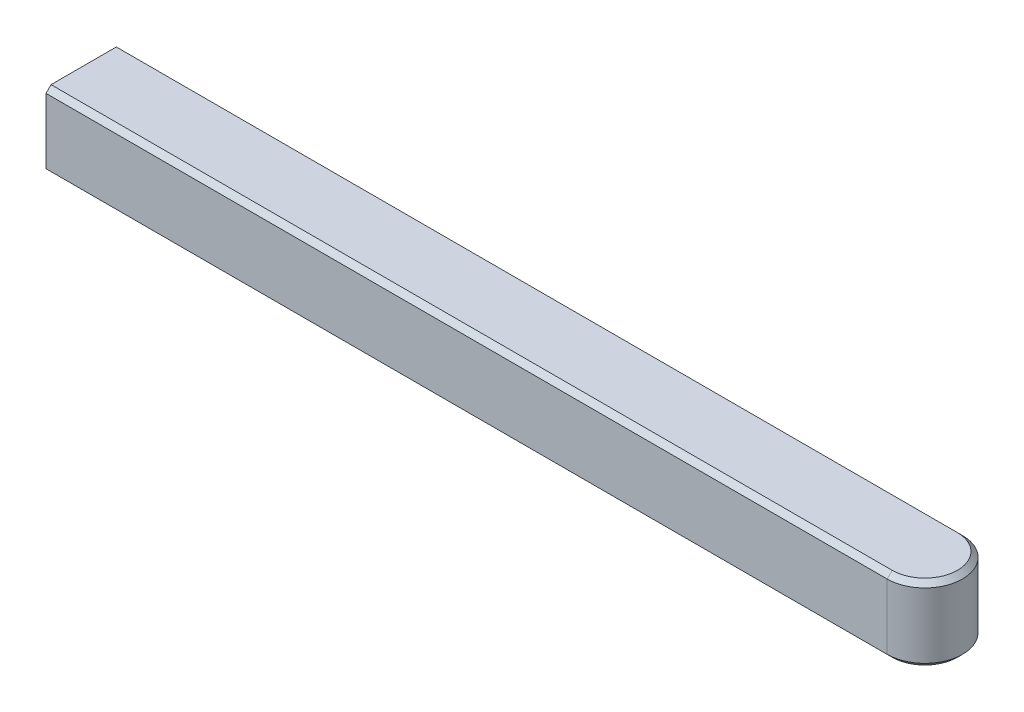
ISO-10303-21;
HEADER;
FILE_DESCRIPTION(('STEP AP214'),'2;1');
FILE_NAME('part.step','',(''),(''),'','','');
FILE_SCHEMA(('AUTOMOTIVE_DESIGN { 1 0 10303 214 1 1 1 1 }'));
ENDSEC;
DATA;
#1=APPLICATION_CONTEXT('core data for automotive mechanical design processes');
#2=APPLICATION_PROTOCOL_DEFINITION('international standard','automotive_design',2000,#1);
#3=PRODUCT_CONTEXT('',#1,'mechanical');
#4=PRODUCT('Part','Part','',(#3));
#5=PRODUCT_RELATED_PRODUCT_CATEGORY('part','',(#4));
#6=PRODUCT_DEFINITION_FORMATION('','',#4);
#7=PRODUCT_DEFINITION_CONTEXT('part definition',#1,'design');
#8=PRODUCT_DEFINITION('design','',#6,#7);
#9=PRODUCT_DEFINITION_SHAPE('','',#8);
#10=(LENGTH_UNIT() NAMED_UNIT(*) SI_UNIT(.MILLI.,.METRE.));
#11=(NAMED_UNIT(*) PLANE_ANGLE_UNIT() SI_UNIT($,.RADIAN.));
#12=(NAMED_UNIT(*) SI_UNIT($,.STERADIAN.) SOLID_ANGLE_UNIT());
#13=UNCERTAINTY_MEASURE_WITH_UNIT(LENGTH_MEASURE(1.E-05),#10,'distance_accuracy_value','');
#14=(GEOMETRIC_REPRESENTATION_CONTEXT(3) GLOBAL_UNCERTAINTY_ASSIGNED_CONTEXT((#13)) GLOBAL_UNIT_ASSIGNED_CONTEXT((#10,
#11,#12)) REPRESENTATION_CONTEXT('',''));
#15=CARTESIAN_POINT('',(0.,0.,0.));
#16=DIRECTION('',(0.,0.,1.));
#17=DIRECTION('',(1.,0.,0.));
#18=AXIS2_PLACEMENT_3D('',#15,#16,#17);
#19=CARTESIAN_POINT('',(16.,0.,0.));
#20=DIRECTION('',(0.,-1.,0.));
#21=DIRECTION('',(0.,0.,-1.));
#22=AXIS2_PLACEMENT_3D('',#19,#20,#21);
#23=CYLINDRICAL_SURFACE('',#22,1.5);
#24=DIRECTION('',(0.,-1.,0.));
#25=VECTOR('',#24,1.);
#26=CARTESIAN_POINT('',(16.,3.,1.5));
#27=LINE('',#26,#25);
#28=CARTESIAN_POINT('',(16.,0.199999999999992,1.5));
#29=VERTEX_POINT('',#28);
#30=CARTESIAN_POINT('',(16.,2.8,1.5));
#31=VERTEX_POINT('',#30);
#32=EDGE_CURVE('E123',#29,#31,#27,.F.);
#33=ORIENTED_EDGE('',*,*,#32,.F.);
#34=CARTESIAN_POINT('',(16.,0.199999999999992,0.));
#35=DIRECTION('',(0.,1.,0.));
#36=DIRECTION('',(0.,0.,1.));
#37=AXIS2_PLACEMENT_3D('',#34,#35,#36);
#38=CIRCLE('',#37,1.5);
#39=CARTESIAN_POINT('',(16.,0.199999999999992,-1.5));
#40=VERTEX_POINT('',#39);
#41=EDGE_CURVE('E122',#29,#40,#38,.T.);
#42=ORIENTED_EDGE('',*,*,#41,.T.);
#43=DIRECTION('',(0.,-1.,0.));
#44=VECTOR('',#43,1.);
#45=CARTESIAN_POINT('',(16.,3.,-1.5));
#46=LINE('',#45,#44);
#47=CARTESIAN_POINT('',(16.,2.8,-1.5));
#48=VERTEX_POINT('',#47);
#49=EDGE_CURVE('E108',#48,#40,#46,.T.);
#50=ORIENTED_EDGE('',*,*,#49,.F.);
#51=CARTESIAN_POINT('',(16.,2.8,0.));
#52=DIRECTION('',(0.,1.,0.));
#53=DIRECTION('',(0.,0.,1.));
#54=AXIS2_PLACEMENT_3D('',#51,#52,#53);
#55=CIRCLE('',#54,1.5);
#56=EDGE_CURVE('E119',#48,#31,#55,.F.);
#57=ORIENTED_EDGE('',*,*,#56,.T.);
#58=EDGE_LOOP('',(#33,#42,#50,#57));
#59=FACE_BOUND('',#58,.T.);
#60=ADVANCED_FACE('F37',(#59),#23,.T.);
#61=CARTESIAN_POINT('',(-17.5,3.,-1.5));
#62=DIRECTION('',(1.,0.,0.));
#63=DIRECTION('',(0.,0.,-1.));
#64=AXIS2_PLACEMENT_3D('',#61,#62,#63);
#65=PLANE('',#64);
#66=DIRECTION('',(0.,-1.,0.));
#67=VECTOR('',#66,1.);
#68=CARTESIAN_POINT('',(-17.5,3.,-1.5));
#69=LINE('',#68,#67);
#70=CARTESIAN_POINT('',(-17.5,2.8,-1.5));
#71=VERTEX_POINT('',#70);
#72=CARTESIAN_POINT('',(-17.5,0.199999999999992,-1.5));
#73=VERTEX_POINT('',#72);
#74=EDGE_CURVE('E111',#71,#73,#69,.T.);
#75=ORIENTED_EDGE('',*,*,#74,.T.);
#76=DIRECTION('',(0.,0.707106781186535,-0.70710678118656));
#77=VECTOR('',#76,1.);
#78=CARTESIAN_POINT('',(-17.5,0.199999999999992,-1.5));
#79=LINE('',#78,#77);
#80=CARTESIAN_POINT('',(-17.5,0.,-1.3));
#81=VERTEX_POINT('',#80);
#82=EDGE_CURVE('E153',#73,#81,#79,.F.);
#83=ORIENTED_EDGE('',*,*,#82,.T.);
#84=DIRECTION('',(0.,0.,1.));
#85=VECTOR('',#84,1.);
#86=CARTESIAN_POINT('',(-17.5,0.,-1.5));
#87=LINE('',#86,#85);
#88=CARTESIAN_POINT('',(-17.5,0.,1.3));
#89=VERTEX_POINT('',#88);
#90=EDGE_CURVE('E138',#81,#89,#87,.T.);
#91=ORIENTED_EDGE('',*,*,#90,.T.);
#92=DIRECTION('',(0.,-0.707106781186535,-0.70710678118656));
#93=VECTOR('',#92,1.);
#94=CARTESIAN_POINT('',(-17.5,0.199999999999992,1.5));
#95=LINE('',#94,#93);
#96=CARTESIAN_POINT('',(-17.5,0.199999999999992,1.5));
#97=VERTEX_POINT('',#96);
#98=EDGE_CURVE('E155',#89,#97,#95,.F.);
#99=ORIENTED_EDGE('',*,*,#98,.T.);
#100=DIRECTION('',(0.,-1.,0.));
#101=VECTOR('',#100,1.);
#102=CARTESIAN_POINT('',(-17.5,3.,1.5));
#103=LINE('',#102,#101);
#104=CARTESIAN_POINT('',(-17.5,2.8,1.5));
#105=VERTEX_POINT('',#104);
#106=EDGE_CURVE('E163',#105,#97,#103,.T.);
#107=ORIENTED_EDGE('',*,*,#106,.F.);
#108=DIRECTION('',(0.,0.707106781186548,-0.707106781186548));
#109=VECTOR('',#108,1.);
#110=CARTESIAN_POINT('',(-17.5,3.,1.3));
#111=LINE('',#110,#109);
#112=CARTESIAN_POINT('',(-17.5,3.,1.3));
#113=VERTEX_POINT('',#112);
#114=EDGE_CURVE('E159',#105,#113,#111,.T.);
#115=ORIENTED_EDGE('',*,*,#114,.T.);
#116=DIRECTION('',(0.,0.,1.));
#117=VECTOR('',#116,1.);
#118=CARTESIAN_POINT('',(-17.5,3.,-1.5));
#119=LINE('',#118,#117);
#120=CARTESIAN_POINT('',(-17.5,3.,-1.3));
#121=VERTEX_POINT('',#120);
#122=EDGE_CURVE('E167',#121,#113,#119,.T.);
#123=ORIENTED_EDGE('',*,*,#122,.F.);
#124=DIRECTION('',(0.,-0.707106781186548,-0.707106781186548));
#125=VECTOR('',#124,1.);
#126=CARTESIAN_POINT('',(-17.5,3.,-1.3));
#127=LINE('',#126,#125);
#128=EDGE_CURVE('E157',#121,#71,#127,.T.);
#129=ORIENTED_EDGE('',*,*,#128,.T.);
#130=EDGE_LOOP('',(#75,#83,#91,#99,#107,#115,#123,#129));
#131=FACE_BOUND('',#130,.T.);
#132=ADVANCED_FACE('F180',(#131),#65,.F.);
#133=CARTESIAN_POINT('',(-17.5,3.,1.5));
#134=DIRECTION('',(0.,0.,-1.));
#135=DIRECTION('',(-1.,0.,0.));
#136=AXIS2_PLACEMENT_3D('',#133,#134,#135);
#137=PLANE('',#136);
#138=ORIENTED_EDGE('',*,*,#106,.T.);
#139=DIRECTION('',(1.,0.,0.));
#140=VECTOR('',#139,1.);
#141=CARTESIAN_POINT('',(-17.5,0.199999999999992,1.5));
#142=LINE('',#141,#140);
#143=EDGE_CURVE('E143',#97,#29,#142,.T.);
#144=ORIENTED_EDGE('',*,*,#143,.T.);
#145=ORIENTED_EDGE('',*,*,#32,.T.);
#146=DIRECTION('',(-1.,0.,0.));
#147=VECTOR('',#146,1.);
#148=CARTESIAN_POINT('',(-17.5,2.8,1.5));
#149=LINE('',#148,#147);
#150=EDGE_CURVE('E145',#31,#105,#149,.T.);
#151=ORIENTED_EDGE('',*,*,#150,.T.);
#152=EDGE_LOOP('',(#138,#144,#145,#151));
#153=FACE_BOUND('',#152,.T.);
#154=ADVANCED_FACE('F178',(#153),#137,.F.);
#155=CARTESIAN_POINT('',(-17.5,3.,-1.5));
#156=DIRECTION('',(0.,0.,1.));
#157=DIRECTION('',(1.,0.,0.));
#158=AXIS2_PLACEMENT_3D('',#155,#156,#157);
#159=PLANE('',#158);
#160=ORIENTED_EDGE('',*,*,#49,.T.);
#161=DIRECTION('',(-1.,0.,0.));
#162=VECTOR('',#161,1.);
#163=CARTESIAN_POINT('',(-17.5,0.199999999999992,-1.5));
#164=LINE('',#163,#162);
#165=EDGE_CURVE('E114',#40,#73,#164,.T.);
#166=ORIENTED_EDGE('',*,*,#165,.T.);
#167=ORIENTED_EDGE('',*,*,#74,.F.);
#168=DIRECTION('',(1.,0.,0.));
#169=VECTOR('',#168,1.);
#170=CARTESIAN_POINT('',(16.,2.8,-1.5));
#171=LINE('',#170,#169);
#172=EDGE_CURVE('E104',#71,#48,#171,.T.);
#173=ORIENTED_EDGE('',*,*,#172,.T.);
#174=EDGE_LOOP('',(#160,#166,#167,#173));
#175=FACE_BOUND('',#174,.T.);
#176=ADVANCED_FACE('F106',(#175),#159,.F.);
#177=CARTESIAN_POINT('',(0.,3.,0.));
#178=DIRECTION('',(0.,1.,0.));
#179=DIRECTION('',(0.,0.,1.));
#180=AXIS2_PLACEMENT_3D('',#177,#178,#179);
#181=PLANE('',#180);
#182=CARTESIAN_POINT('',(16.,3.,0.));
#183=DIRECTION('',(0.,1.,0.));
#184=DIRECTION('',(0.,0.,1.));
#185=AXIS2_PLACEMENT_3D('',#182,#183,#184);
#186=CIRCLE('',#185,1.3);
#187=CARTESIAN_POINT('',(16.,3.,1.3));
#188=VERTEX_POINT('',#187);
#189=CARTESIAN_POINT('',(16.,3.,-1.3));
#190=VERTEX_POINT('',#189);
#191=EDGE_CURVE('E46',#188,#190,#186,.T.);
#192=ORIENTED_EDGE('',*,*,#191,.T.);
#193=DIRECTION('',(-1.,0.,0.));
#194=VECTOR('',#193,1.);
#195=CARTESIAN_POINT('',(-17.5,3.,-1.3));
#196=LINE('',#195,#194);
#197=EDGE_CURVE('E11',#190,#121,#196,.T.);
#198=ORIENTED_EDGE('',*,*,#197,.T.);
#199=ORIENTED_EDGE('',*,*,#122,.T.);
#200=DIRECTION('',(1.,0.,0.));
#201=VECTOR('',#200,1.);
#202=CARTESIAN_POINT('',(16.,3.,1.3));
#203=LINE('',#202,#201);
#204=EDGE_CURVE('E57',#113,#188,#203,.T.);
#205=ORIENTED_EDGE('',*,*,#204,.T.);
#206=EDGE_LOOP('',(#192,#198,#199,#205));
#207=FACE_BOUND('',#206,.T.);
#208=ADVANCED_FACE('F171',(#207),#181,.T.);
#209=CARTESIAN_POINT('',(0.,0.,0.));
#210=DIRECTION('',(0.,1.,0.));
#211=DIRECTION('',(0.,0.,1.));
#212=AXIS2_PLACEMENT_3D('',#209,#210,#211);
#213=PLANE('',#212);
#214=ORIENTED_EDGE('',*,*,#90,.F.);
#215=DIRECTION('',(1.,0.,0.));
#216=VECTOR('',#215,1.);
#217=CARTESIAN_POINT('',(0.,0.,-1.3));
#218=LINE('',#217,#216);
#219=CARTESIAN_POINT('',(16.,0.,-1.3));
#220=VERTEX_POINT('',#219);
#221=EDGE_CURVE('E130',#81,#220,#218,.T.);
#222=ORIENTED_EDGE('',*,*,#221,.T.);
#223=CARTESIAN_POINT('',(16.,0.,0.));
#224=DIRECTION('',(0.,1.,0.));
#225=DIRECTION('',(0.,0.,1.));
#226=AXIS2_PLACEMENT_3D('',#223,#224,#225);
#227=CIRCLE('',#226,1.3);
#228=CARTESIAN_POINT('',(16.,0.,1.3));
#229=VERTEX_POINT('',#228);
#230=EDGE_CURVE('E149',#220,#229,#227,.F.);
#231=ORIENTED_EDGE('',*,*,#230,.T.);
#232=DIRECTION('',(-1.,0.,0.));
#233=VECTOR('',#232,1.);
#234=CARTESIAN_POINT('',(0.,0.,1.3));
#235=LINE('',#234,#233);
#236=EDGE_CURVE('E151',#229,#89,#235,.T.);
#237=ORIENTED_EDGE('',*,*,#236,.T.);
#238=EDGE_LOOP('',(#214,#222,#231,#237));
#239=FACE_BOUND('',#238,.T.);
#240=ADVANCED_FACE('F195',(#239),#213,.F.);
#241=CARTESIAN_POINT('',(-17.5,0.199999999999992,1.5));
#242=DIRECTION('',(0.,0.70710678118656,-0.707106781186535));
#243=DIRECTION('',(1.,0.,0.));
#244=AXIS2_PLACEMENT_3D('',#241,#242,#243);
#245=PLANE('',#244);
#246=ORIENTED_EDGE('',*,*,#98,.F.);
#247=ORIENTED_EDGE('',*,*,#236,.F.);
#248=DIRECTION('',(0.,-0.707106781186535,-0.70710678118656));
#249=VECTOR('',#248,1.);
#250=CARTESIAN_POINT('',(16.,0.199999999999992,1.5));
#251=LINE('',#250,#249);
#252=EDGE_CURVE('E135',#29,#229,#251,.T.);
#253=ORIENTED_EDGE('',*,*,#252,.F.);
#254=ORIENTED_EDGE('',*,*,#143,.F.);
#255=EDGE_LOOP('',(#246,#247,#253,#254));
#256=FACE_BOUND('',#255,.T.);
#257=ADVANCED_FACE('F185',(#256),#245,.F.);
#258=CARTESIAN_POINT('',(16.,0.,0.));
#259=DIRECTION('',(0.,1.,0.));
#260=DIRECTION('',(0.,0.,1.));
#261=AXIS2_PLACEMENT_3D('',#258,#259,#260);
#262=CONICAL_SURFACE('',#261,1.3,0.785398163397466);
#263=ORIENTED_EDGE('',*,*,#252,.T.);
#264=ORIENTED_EDGE('',*,*,#230,.F.);
#265=DIRECTION('',(0.,-0.707106781186535,0.70710678118656));
#266=VECTOR('',#265,1.);
#267=CARTESIAN_POINT('',(16.,0.199999999999992,-1.5));
#268=LINE('',#267,#266);
#269=EDGE_CURVE('E133',#40,#220,#268,.T.);
#270=ORIENTED_EDGE('',*,*,#269,.F.);
#271=ORIENTED_EDGE('',*,*,#41,.F.);
#272=EDGE_LOOP('',(#263,#264,#270,#271));
#273=FACE_BOUND('',#272,.T.);
#274=ADVANCED_FACE('F189',(#273),#262,.T.);
#275=CARTESIAN_POINT('',(-17.5,0.199999999999992,-1.5));
#276=DIRECTION('',(0.,0.70710678118656,0.707106781186535));
#277=DIRECTION('',(-1.,0.,0.));
#278=AXIS2_PLACEMENT_3D('',#275,#276,#277);
#279=PLANE('',#278);
#280=ORIENTED_EDGE('',*,*,#269,.T.);
#281=ORIENTED_EDGE('',*,*,#221,.F.);
#282=ORIENTED_EDGE('',*,*,#82,.F.);
#283=ORIENTED_EDGE('',*,*,#165,.F.);
#284=EDGE_LOOP('',(#280,#281,#282,#283));
#285=FACE_BOUND('',#284,.T.);
#286=ADVANCED_FACE('F193',(#285),#279,.F.);
#287=CARTESIAN_POINT('',(0.,3.,1.3));
#288=DIRECTION('',(0.,0.707106781186547,0.707106781186547));
#289=DIRECTION('',(-1.,0.,0.));
#290=AXIS2_PLACEMENT_3D('',#287,#288,#289);
#291=PLANE('',#290);
#292=ORIENTED_EDGE('',*,*,#114,.F.);
#293=ORIENTED_EDGE('',*,*,#150,.F.);
#294=DIRECTION('',(0.,-0.707106781186547,0.707106781186547));
#295=VECTOR('',#294,1.);
#296=CARTESIAN_POINT('',(16.,3.,1.3));
#297=LINE('',#296,#295);
#298=EDGE_CURVE('E41',#188,#31,#297,.T.);
#299=ORIENTED_EDGE('',*,*,#298,.F.);
#300=ORIENTED_EDGE('',*,*,#204,.F.);
#301=EDGE_LOOP('',(#292,#293,#299,#300));
#302=FACE_BOUND('',#301,.T.);
#303=ADVANCED_FACE('F39',(#302),#291,.T.);
#304=CARTESIAN_POINT('',(16.,3.,0.));
#305=DIRECTION('',(0.,-1.,0.));
#306=DIRECTION('',(0.,0.,-1.));
#307=AXIS2_PLACEMENT_3D('',#304,#305,#306);
#308=CONICAL_SURFACE('',#307,1.3,0.785398163397448);
#309=ORIENTED_EDGE('',*,*,#298,.T.);
#310=ORIENTED_EDGE('',*,*,#56,.F.);
#311=DIRECTION('',(0.,-0.707106781186547,-0.707106781186547));
#312=VECTOR('',#311,1.);
#313=CARTESIAN_POINT('',(16.,3.,-1.3));
#314=LINE('',#313,#312);
#315=EDGE_CURVE('E128',#190,#48,#314,.T.);
#316=ORIENTED_EDGE('',*,*,#315,.F.);
#317=ORIENTED_EDGE('',*,*,#191,.F.);
#318=EDGE_LOOP('',(#309,#310,#316,#317));
#319=FACE_BOUND('',#318,.T.);
#320=ADVANCED_FACE('F127',(#319),#308,.T.);
#321=CARTESIAN_POINT('',(0.,3.,-1.3));
#322=DIRECTION('',(0.,0.707106781186547,-0.707106781186547));
#323=DIRECTION('',(1.,0.,0.));
#324=AXIS2_PLACEMENT_3D('',#321,#322,#323);
#325=PLANE('',#324);
#326=ORIENTED_EDGE('',*,*,#315,.T.);
#327=ORIENTED_EDGE('',*,*,#172,.F.);
#328=ORIENTED_EDGE('',*,*,#128,.F.);
#329=ORIENTED_EDGE('',*,*,#197,.F.);
#330=EDGE_LOOP('',(#326,#327,#328,#329));
#331=FACE_BOUND('',#330,.T.);
#332=ADVANCED_FACE('F132',(#331),#325,.T.);
#333=CLOSED_SHELL('',(#60,#132,#154,#176,#208,#240,#257,#274,#286,#303,#320,#332));
#334=MANIFOLD_SOLID_BREP('B2',#333);
#335=ADVANCED_BREP_SHAPE_REPRESENTATION('',(#18,#334),#14);
#336=SHAPE_DEFINITION_REPRESENTATION(#9,#335);
ENDSEC;
END-ISO-10303-21;
